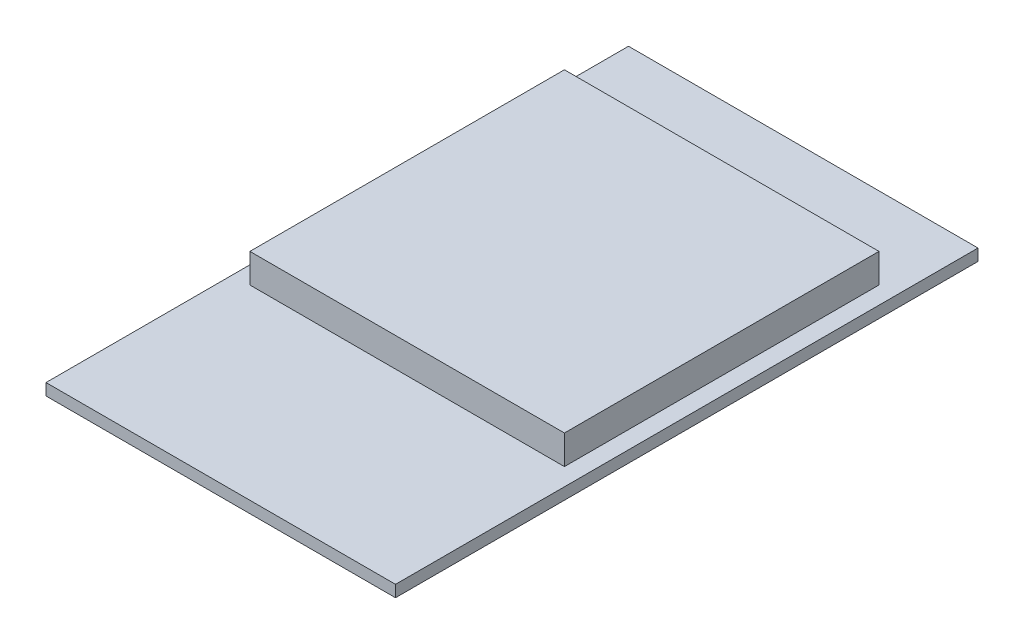
ISO-10303-21;
HEADER;
FILE_DESCRIPTION(('STEP AP214'),'2;1');
FILE_NAME('part.step','',(''),(''),'','','');
FILE_SCHEMA(('AUTOMOTIVE_DESIGN { 1 0 10303 214 1 1 1 1 }'));
ENDSEC;
DATA;
#1=APPLICATION_CONTEXT('core data for automotive mechanical design processes');
#2=APPLICATION_PROTOCOL_DEFINITION('international standard','automotive_design',2000,#1);
#3=PRODUCT_CONTEXT('',#1,'mechanical');
#4=PRODUCT('Part','Part','',(#3));
#5=PRODUCT_RELATED_PRODUCT_CATEGORY('part','',(#4));
#6=PRODUCT_DEFINITION_FORMATION('','',#4);
#7=PRODUCT_DEFINITION_CONTEXT('part definition',#1,'design');
#8=PRODUCT_DEFINITION('design','',#6,#7);
#9=PRODUCT_DEFINITION_SHAPE('','',#8);
#10=(LENGTH_UNIT() NAMED_UNIT(*) SI_UNIT(.MILLI.,.METRE.));
#11=(NAMED_UNIT(*) PLANE_ANGLE_UNIT() SI_UNIT($,.RADIAN.));
#12=(NAMED_UNIT(*) SI_UNIT($,.STERADIAN.) SOLID_ANGLE_UNIT());
#13=UNCERTAINTY_MEASURE_WITH_UNIT(LENGTH_MEASURE(1.E-05),#10,'distance_accuracy_value','');
#14=(GEOMETRIC_REPRESENTATION_CONTEXT(3) GLOBAL_UNCERTAINTY_ASSIGNED_CONTEXT((#13)) GLOBAL_UNIT_ASSIGNED_CONTEXT((#10,
#11,#12)) REPRESENTATION_CONTEXT('',''));
#15=CARTESIAN_POINT('',(0.,0.,0.));
#16=DIRECTION('',(0.,0.,1.));
#17=DIRECTION('',(1.,0.,0.));
#18=AXIS2_PLACEMENT_3D('',#15,#16,#17);
#19=CARTESIAN_POINT('',(0.,1.,0.));
#20=DIRECTION('',(0.,-1.,0.));
#21=DIRECTION('',(0.,0.,-1.));
#22=AXIS2_PLACEMENT_3D('',#19,#20,#21);
#23=PLANE('',#22);
#24=DIRECTION('',(0.,0.,1.));
#25=VECTOR('',#24,1.);
#26=CARTESIAN_POINT('',(0.,1.,0.));
#27=LINE('',#26,#25);
#28=CARTESIAN_POINT('',(0.,1.,-50.));
#29=VERTEX_POINT('',#28);
#30=CARTESIAN_POINT('',(0.,1.,0.));
#31=VERTEX_POINT('',#30);
#32=EDGE_CURVE('E141',#29,#31,#27,.T.);
#33=ORIENTED_EDGE('',*,*,#32,.T.);
#34=DIRECTION('',(1.,0.,0.));
#35=VECTOR('',#34,1.);
#36=CARTESIAN_POINT('',(0.,1.,0.));
#37=LINE('',#36,#35);
#38=CARTESIAN_POINT('',(30.,1.,0.));
#39=VERTEX_POINT('',#38);
#40=EDGE_CURVE('E143',#31,#39,#37,.T.);
#41=ORIENTED_EDGE('',*,*,#40,.T.);
#42=DIRECTION('',(0.,0.,-1.));
#43=VECTOR('',#42,1.);
#44=CARTESIAN_POINT('',(30.,1.,0.));
#45=LINE('',#44,#43);
#46=CARTESIAN_POINT('',(30.,1.,-50.));
#47=VERTEX_POINT('',#46);
#48=EDGE_CURVE('E150',#39,#47,#45,.T.);
#49=ORIENTED_EDGE('',*,*,#48,.T.);
#50=DIRECTION('',(-1.,0.,0.));
#51=VECTOR('',#50,1.);
#52=CARTESIAN_POINT('',(0.,1.,-50.));
#53=LINE('',#52,#51);
#54=EDGE_CURVE('E146',#47,#29,#53,.T.);
#55=ORIENTED_EDGE('',*,*,#54,.T.);
#56=EDGE_LOOP('',(#33,#41,#49,#55));
#57=FACE_BOUND('',#56,.T.);
#58=DIRECTION('',(0.,0.,1.));
#59=VECTOR('',#58,1.);
#60=CARTESIAN_POINT('',(1.5,1.,-16.));
#61=LINE('',#60,#59);
#62=CARTESIAN_POINT('',(1.5,1.,-43.));
#63=VERTEX_POINT('',#62);
#64=CARTESIAN_POINT('',(1.5,1.,-16.));
#65=VERTEX_POINT('',#64);
#66=EDGE_CURVE('E65',#63,#65,#61,.T.);
#67=ORIENTED_EDGE('',*,*,#66,.F.);
#68=DIRECTION('',(-1.,0.,0.));
#69=VECTOR('',#68,1.);
#70=CARTESIAN_POINT('',(1.5,1.,-43.));
#71=LINE('',#70,#69);
#72=CARTESIAN_POINT('',(28.5,1.,-43.));
#73=VERTEX_POINT('',#72);
#74=EDGE_CURVE('E67',#73,#63,#71,.T.);
#75=ORIENTED_EDGE('',*,*,#74,.F.);
#76=DIRECTION('',(0.,0.,-1.));
#77=VECTOR('',#76,1.);
#78=CARTESIAN_POINT('',(28.5,1.,-16.));
#79=LINE('',#78,#77);
#80=CARTESIAN_POINT('',(28.5,1.,-16.));
#81=VERTEX_POINT('',#80);
#82=EDGE_CURVE('E318',#81,#73,#79,.T.);
#83=ORIENTED_EDGE('',*,*,#82,.F.);
#84=DIRECTION('',(1.,0.,0.));
#85=VECTOR('',#84,1.);
#86=CARTESIAN_POINT('',(1.5,1.,-16.));
#87=LINE('',#86,#85);
#88=EDGE_CURVE('E323',#65,#81,#87,.T.);
#89=ORIENTED_EDGE('',*,*,#88,.F.);
#90=EDGE_LOOP('',(#67,#75,#83,#89));
#91=FACE_BOUND('',#90,.T.);
#92=ADVANCED_FACE('F50',(#57,#91),#23,.F.);
#93=CARTESIAN_POINT('',(0.,1.,0.));
#94=DIRECTION('',(1.,0.,0.));
#95=DIRECTION('',(0.,0.,-1.));
#96=AXIS2_PLACEMENT_3D('',#93,#94,#95);
#97=PLANE('',#96);
#98=DIRECTION('',(0.,0.,1.));
#99=VECTOR('',#98,1.);
#100=CARTESIAN_POINT('',(0.,0.,0.));
#101=LINE('',#100,#99);
#102=CARTESIAN_POINT('',(0.,0.,-50.));
#103=VERTEX_POINT('',#102);
#104=CARTESIAN_POINT('',(0.,0.,0.));
#105=VERTEX_POINT('',#104);
#106=EDGE_CURVE('E135',#103,#105,#101,.T.);
#107=ORIENTED_EDGE('',*,*,#106,.T.);
#108=DIRECTION('',(0.,-1.,0.));
#109=VECTOR('',#108,1.);
#110=CARTESIAN_POINT('',(0.,1.,0.));
#111=LINE('',#110,#109);
#112=EDGE_CURVE('E11',#31,#105,#111,.T.);
#113=ORIENTED_EDGE('',*,*,#112,.F.);
#114=ORIENTED_EDGE('',*,*,#32,.F.);
#115=DIRECTION('',(0.,-1.,0.));
#116=VECTOR('',#115,1.);
#117=CARTESIAN_POINT('',(0.,1.,-50.));
#118=LINE('',#117,#116);
#119=EDGE_CURVE('E148',#29,#103,#118,.T.);
#120=ORIENTED_EDGE('',*,*,#119,.T.);
#121=EDGE_LOOP('',(#107,#113,#114,#120));
#122=FACE_BOUND('',#121,.T.);
#123=ADVANCED_FACE('F47',(#122),#97,.F.);
#124=CARTESIAN_POINT('',(0.,1.,0.));
#125=DIRECTION('',(0.,0.,-1.));
#126=DIRECTION('',(-1.,0.,0.));
#127=AXIS2_PLACEMENT_3D('',#124,#125,#126);
#128=PLANE('',#127);
#129=DIRECTION('',(1.,0.,0.));
#130=VECTOR('',#129,1.);
#131=CARTESIAN_POINT('',(0.,0.,0.));
#132=LINE('',#131,#130);
#133=CARTESIAN_POINT('',(30.,0.,0.));
#134=VERTEX_POINT('',#133);
#135=EDGE_CURVE('E134',#105,#134,#132,.T.);
#136=ORIENTED_EDGE('',*,*,#135,.T.);
#137=DIRECTION('',(0.,-1.,0.));
#138=VECTOR('',#137,1.);
#139=CARTESIAN_POINT('',(30.,1.,0.));
#140=LINE('',#139,#138);
#141=EDGE_CURVE('E54',#39,#134,#140,.T.);
#142=ORIENTED_EDGE('',*,*,#141,.F.);
#143=ORIENTED_EDGE('',*,*,#40,.F.);
#144=ORIENTED_EDGE('',*,*,#112,.T.);
#145=EDGE_LOOP('',(#136,#142,#143,#144));
#146=FACE_BOUND('',#145,.T.);
#147=ADVANCED_FACE('F179',(#146),#128,.F.);
#148=CARTESIAN_POINT('',(30.,1.,0.));
#149=DIRECTION('',(-1.,0.,0.));
#150=DIRECTION('',(0.,0.,1.));
#151=AXIS2_PLACEMENT_3D('',#148,#149,#150);
#152=PLANE('',#151);
#153=DIRECTION('',(0.,0.,-1.));
#154=VECTOR('',#153,1.);
#155=CARTESIAN_POINT('',(30.,0.,0.));
#156=LINE('',#155,#154);
#157=CARTESIAN_POINT('',(30.,0.,-50.));
#158=VERTEX_POINT('',#157);
#159=EDGE_CURVE('E151',#134,#158,#156,.T.);
#160=ORIENTED_EDGE('',*,*,#159,.T.);
#161=DIRECTION('',(0.,-1.,0.));
#162=VECTOR('',#161,1.);
#163=CARTESIAN_POINT('',(30.,1.,-50.));
#164=LINE('',#163,#162);
#165=EDGE_CURVE('E156',#47,#158,#164,.T.);
#166=ORIENTED_EDGE('',*,*,#165,.F.);
#167=ORIENTED_EDGE('',*,*,#48,.F.);
#168=ORIENTED_EDGE('',*,*,#141,.T.);
#169=EDGE_LOOP('',(#160,#166,#167,#168));
#170=FACE_BOUND('',#169,.T.);
#171=ADVANCED_FACE('F164',(#170),#152,.F.);
#172=CARTESIAN_POINT('',(0.,1.,-50.));
#173=DIRECTION('',(0.,0.,1.));
#174=DIRECTION('',(1.,0.,0.));
#175=AXIS2_PLACEMENT_3D('',#172,#173,#174);
#176=PLANE('',#175);
#177=DIRECTION('',(-1.,0.,0.));
#178=VECTOR('',#177,1.);
#179=CARTESIAN_POINT('',(0.,0.,-50.));
#180=LINE('',#179,#178);
#181=EDGE_CURVE('E144',#158,#103,#180,.T.);
#182=ORIENTED_EDGE('',*,*,#181,.T.);
#183=ORIENTED_EDGE('',*,*,#119,.F.);
#184=ORIENTED_EDGE('',*,*,#54,.F.);
#185=ORIENTED_EDGE('',*,*,#165,.T.);
#186=EDGE_LOOP('',(#182,#183,#184,#185));
#187=FACE_BOUND('',#186,.T.);
#188=ADVANCED_FACE('F174',(#187),#176,.F.);
#189=CARTESIAN_POINT('',(0.,0.,0.));
#190=DIRECTION('',(0.,-1.,0.));
#191=DIRECTION('',(0.,0.,-1.));
#192=AXIS2_PLACEMENT_3D('',#189,#190,#191);
#193=PLANE('',#192);
#194=ORIENTED_EDGE('',*,*,#106,.F.);
#195=ORIENTED_EDGE('',*,*,#181,.F.);
#196=ORIENTED_EDGE('',*,*,#159,.F.);
#197=ORIENTED_EDGE('',*,*,#135,.F.);
#198=EDGE_LOOP('',(#194,#195,#196,#197));
#199=FACE_BOUND('',#198,.T.);
#200=ADVANCED_FACE('F173',(#199),#193,.T.);
#201=CARTESIAN_POINT('',(1.5,3.5,-16.));
#202=DIRECTION('',(1.,0.,0.));
#203=DIRECTION('',(0.,0.,-1.));
#204=AXIS2_PLACEMENT_3D('',#201,#202,#203);
#205=PLANE('',#204);
#206=ORIENTED_EDGE('',*,*,#66,.T.);
#207=DIRECTION('',(0.,-1.,0.));
#208=VECTOR('',#207,1.);
#209=CARTESIAN_POINT('',(1.5,3.5,-16.));
#210=LINE('',#209,#208);
#211=CARTESIAN_POINT('',(1.5,3.5,-16.));
#212=VERTEX_POINT('',#211);
#213=EDGE_CURVE('E113',#212,#65,#210,.T.);
#214=ORIENTED_EDGE('',*,*,#213,.F.);
#215=DIRECTION('',(0.,0.,1.));
#216=VECTOR('',#215,1.);
#217=CARTESIAN_POINT('',(1.5,3.5,-16.));
#218=LINE('',#217,#216);
#219=CARTESIAN_POINT('',(1.5,3.5,-43.));
#220=VERTEX_POINT('',#219);
#221=EDGE_CURVE('E123',#220,#212,#218,.T.);
#222=ORIENTED_EDGE('',*,*,#221,.F.);
#223=DIRECTION('',(0.,-1.,0.));
#224=VECTOR('',#223,1.);
#225=CARTESIAN_POINT('',(1.5,3.5,-43.));
#226=LINE('',#225,#224);
#227=EDGE_CURVE('E316',#220,#63,#226,.T.);
#228=ORIENTED_EDGE('',*,*,#227,.T.);
#229=EDGE_LOOP('',(#206,#214,#222,#228));
#230=FACE_BOUND('',#229,.T.);
#231=ADVANCED_FACE('F131',(#230),#205,.F.);
#232=CARTESIAN_POINT('',(1.5,3.5,-16.));
#233=DIRECTION('',(0.,0.,-1.));
#234=DIRECTION('',(-1.,0.,0.));
#235=AXIS2_PLACEMENT_3D('',#232,#233,#234);
#236=PLANE('',#235);
#237=ORIENTED_EDGE('',*,*,#88,.T.);
#238=DIRECTION('',(0.,-1.,0.));
#239=VECTOR('',#238,1.);
#240=CARTESIAN_POINT('',(28.5,3.5,-16.));
#241=LINE('',#240,#239);
#242=CARTESIAN_POINT('',(28.5,3.5,-16.));
#243=VERTEX_POINT('',#242);
#244=EDGE_CURVE('E120',#243,#81,#241,.T.);
#245=ORIENTED_EDGE('',*,*,#244,.F.);
#246=DIRECTION('',(1.,0.,0.));
#247=VECTOR('',#246,1.);
#248=CARTESIAN_POINT('',(1.5,3.5,-16.));
#249=LINE('',#248,#247);
#250=EDGE_CURVE('E109',#212,#243,#249,.T.);
#251=ORIENTED_EDGE('',*,*,#250,.F.);
#252=ORIENTED_EDGE('',*,*,#213,.T.);
#253=EDGE_LOOP('',(#237,#245,#251,#252));
#254=FACE_BOUND('',#253,.T.);
#255=ADVANCED_FACE('F111',(#254),#236,.F.);
#256=CARTESIAN_POINT('',(28.5,3.5,-16.));
#257=DIRECTION('',(-1.,0.,0.));
#258=DIRECTION('',(0.,0.,1.));
#259=AXIS2_PLACEMENT_3D('',#256,#257,#258);
#260=PLANE('',#259);
#261=ORIENTED_EDGE('',*,*,#82,.T.);
#262=DIRECTION('',(0.,-1.,0.));
#263=VECTOR('',#262,1.);
#264=CARTESIAN_POINT('',(28.5,3.5,-43.));
#265=LINE('',#264,#263);
#266=CARTESIAN_POINT('',(28.5,3.5,-43.));
#267=VERTEX_POINT('',#266);
#268=EDGE_CURVE('E140',#267,#73,#265,.T.);
#269=ORIENTED_EDGE('',*,*,#268,.F.);
#270=DIRECTION('',(0.,0.,-1.));
#271=VECTOR('',#270,1.);
#272=CARTESIAN_POINT('',(28.5,3.5,-16.));
#273=LINE('',#272,#271);
#274=EDGE_CURVE('E119',#243,#267,#273,.T.);
#275=ORIENTED_EDGE('',*,*,#274,.F.);
#276=ORIENTED_EDGE('',*,*,#244,.T.);
#277=EDGE_LOOP('',(#261,#269,#275,#276));
#278=FACE_BOUND('',#277,.T.);
#279=ADVANCED_FACE('F218',(#278),#260,.F.);
#280=CARTESIAN_POINT('',(1.5,3.5,-43.));
#281=DIRECTION('',(0.,0.,1.));
#282=DIRECTION('',(1.,0.,0.));
#283=AXIS2_PLACEMENT_3D('',#280,#281,#282);
#284=PLANE('',#283);
#285=ORIENTED_EDGE('',*,*,#74,.T.);
#286=ORIENTED_EDGE('',*,*,#227,.F.);
#287=DIRECTION('',(-1.,0.,0.));
#288=VECTOR('',#287,1.);
#289=CARTESIAN_POINT('',(1.5,3.5,-43.));
#290=LINE('',#289,#288);
#291=EDGE_CURVE('E128',#267,#220,#290,.T.);
#292=ORIENTED_EDGE('',*,*,#291,.F.);
#293=ORIENTED_EDGE('',*,*,#268,.T.);
#294=EDGE_LOOP('',(#285,#286,#292,#293));
#295=FACE_BOUND('',#294,.T.);
#296=ADVANCED_FACE('F225',(#295),#284,.F.);
#297=CARTESIAN_POINT('',(0.,3.5,0.));
#298=DIRECTION('',(0.,-1.,0.));
#299=DIRECTION('',(0.,0.,-1.));
#300=AXIS2_PLACEMENT_3D('',#297,#298,#299);
#301=PLANE('',#300);
#302=ORIENTED_EDGE('',*,*,#221,.T.);
#303=ORIENTED_EDGE('',*,*,#250,.T.);
#304=ORIENTED_EDGE('',*,*,#274,.T.);
#305=ORIENTED_EDGE('',*,*,#291,.T.);
#306=EDGE_LOOP('',(#302,#303,#304,#305));
#307=FACE_BOUND('',#306,.T.);
#308=ADVANCED_FACE('F125',(#307),#301,.F.);
#309=CLOSED_SHELL('',(#92,#123,#147,#171,#188,#200,#231,#255,#279,#296,#308));
#310=MANIFOLD_SOLID_BREP('B2',#309);
#311=ADVANCED_BREP_SHAPE_REPRESENTATION('',(#18,#310),#14);
#312=SHAPE_DEFINITION_REPRESENTATION(#9,#311);
ENDSEC;
END-ISO-10303-21;
